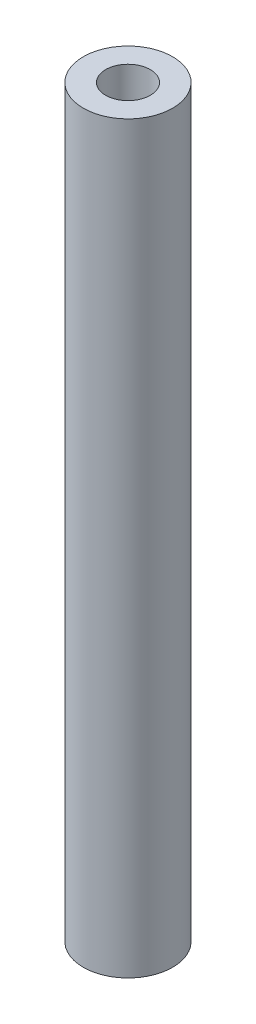
ISO-10303-21;
HEADER;
FILE_DESCRIPTION(('STEP AP214'),'2;1');
FILE_NAME('part.step','',(''),(''),'','','');
FILE_SCHEMA(('AUTOMOTIVE_DESIGN { 1 0 10303 214 1 1 1 1 }'));
ENDSEC;
DATA;
#1=APPLICATION_CONTEXT('core data for automotive mechanical design processes');
#2=APPLICATION_PROTOCOL_DEFINITION('international standard','automotive_design',2000,#1);
#3=PRODUCT_CONTEXT('',#1,'mechanical');
#4=PRODUCT('Part','Part','',(#3));
#5=PRODUCT_RELATED_PRODUCT_CATEGORY('part','',(#4));
#6=PRODUCT_DEFINITION_FORMATION('','',#4);
#7=PRODUCT_DEFINITION_CONTEXT('part definition',#1,'design');
#8=PRODUCT_DEFINITION('design','',#6,#7);
#9=PRODUCT_DEFINITION_SHAPE('','',#8);
#10=(LENGTH_UNIT() NAMED_UNIT(*) SI_UNIT(.MILLI.,.METRE.));
#11=(NAMED_UNIT(*) PLANE_ANGLE_UNIT() SI_UNIT($,.RADIAN.));
#12=(NAMED_UNIT(*) SI_UNIT($,.STERADIAN.) SOLID_ANGLE_UNIT());
#13=UNCERTAINTY_MEASURE_WITH_UNIT(LENGTH_MEASURE(1.E-05),#10,'distance_accuracy_value','');
#14=(GEOMETRIC_REPRESENTATION_CONTEXT(3) GLOBAL_UNCERTAINTY_ASSIGNED_CONTEXT((#13)) GLOBAL_UNIT_ASSIGNED_CONTEXT((#10,
#11,#12)) REPRESENTATION_CONTEXT('',''));
#15=CARTESIAN_POINT('',(0.,0.,0.));
#16=DIRECTION('',(0.,0.,1.));
#17=DIRECTION('',(1.,0.,0.));
#18=AXIS2_PLACEMENT_3D('',#15,#16,#17);
#19=CARTESIAN_POINT('',(0.,50.,0.));
#20=DIRECTION('',(0.,1.,0.));
#21=DIRECTION('',(0.,0.,1.));
#22=AXIS2_PLACEMENT_3D('',#19,#20,#21);
#23=PLANE('',#22);
#24=CARTESIAN_POINT('',(0.,50.,0.));
#25=DIRECTION('',(0.,1.,0.));
#26=DIRECTION('',(0.,0.,1.));
#27=AXIS2_PLACEMENT_3D('',#24,#25,#26);
#28=CIRCLE('',#27,3.);
#29=CARTESIAN_POINT('',(0.,50.,3.));
#30=VERTEX_POINT('',#29);
#31=EDGE_CURVE('E10',#30,#30,#28,.T.);
#32=ORIENTED_EDGE('',*,*,#31,.T.);
#33=EDGE_LOOP('',(#32));
#34=FACE_BOUND('',#33,.T.);
#35=CARTESIAN_POINT('',(0.,50.,0.));
#36=DIRECTION('',(0.,1.,0.));
#37=DIRECTION('',(0.,0.,1.));
#38=AXIS2_PLACEMENT_3D('',#35,#36,#37);
#39=CIRCLE('',#38,1.5);
#40=CARTESIAN_POINT('',(0.,50.,1.5));
#41=VERTEX_POINT('',#40);
#42=EDGE_CURVE('E50',#41,#41,#39,.T.);
#43=ORIENTED_EDGE('',*,*,#42,.F.);
#44=EDGE_LOOP('',(#43));
#45=FACE_BOUND('',#44,.T.);
#46=ADVANCED_FACE('F37',(#34,#45),#23,.T.);
#47=CARTESIAN_POINT('',(0.,0.,0.));
#48=DIRECTION('',(0.,1.,0.));
#49=DIRECTION('',(0.,0.,1.));
#50=AXIS2_PLACEMENT_3D('',#47,#48,#49);
#51=PLANE('',#50);
#52=CARTESIAN_POINT('',(0.,0.,0.));
#53=DIRECTION('',(0.,1.,0.));
#54=DIRECTION('',(0.,0.,1.));
#55=AXIS2_PLACEMENT_3D('',#52,#53,#54);
#56=CIRCLE('',#55,3.);
#57=CARTESIAN_POINT('',(0.,0.,3.));
#58=VERTEX_POINT('',#57);
#59=EDGE_CURVE('E41',#58,#58,#56,.T.);
#60=ORIENTED_EDGE('',*,*,#59,.F.);
#61=EDGE_LOOP('',(#60));
#62=FACE_BOUND('',#61,.T.);
#63=CARTESIAN_POINT('',(0.,0.,0.));
#64=DIRECTION('',(0.,1.,0.));
#65=DIRECTION('',(0.,0.,1.));
#66=AXIS2_PLACEMENT_3D('',#63,#64,#65);
#67=CIRCLE('',#66,1.5);
#68=CARTESIAN_POINT('',(0.,0.,1.5));
#69=VERTEX_POINT('',#68);
#70=EDGE_CURVE('E52',#69,#69,#67,.T.);
#71=ORIENTED_EDGE('',*,*,#70,.T.);
#72=EDGE_LOOP('',(#71));
#73=FACE_BOUND('',#72,.T.);
#74=ADVANCED_FACE('F64',(#62,#73),#51,.F.);
#75=CARTESIAN_POINT('',(0.,50.,0.));
#76=DIRECTION('',(0.,-1.,0.));
#77=DIRECTION('',(0.,0.,-1.));
#78=AXIS2_PLACEMENT_3D('',#75,#76,#77);
#79=CYLINDRICAL_SURFACE('',#78,3.);
#80=ORIENTED_EDGE('',*,*,#31,.F.);
#81=EDGE_LOOP('',(#80));
#82=FACE_BOUND('',#81,.T.);
#83=ORIENTED_EDGE('',*,*,#59,.T.);
#84=EDGE_LOOP('',(#83));
#85=FACE_BOUND('',#84,.T.);
#86=ADVANCED_FACE('F39',(#82,#85),#79,.T.);
#87=CARTESIAN_POINT('',(0.,50.,0.));
#88=DIRECTION('',(0.,-1.,0.));
#89=DIRECTION('',(0.,0.,-1.));
#90=AXIS2_PLACEMENT_3D('',#87,#88,#89);
#91=CYLINDRICAL_SURFACE('',#90,1.5);
#92=ORIENTED_EDGE('',*,*,#42,.T.);
#93=EDGE_LOOP('',(#92));
#94=FACE_BOUND('',#93,.T.);
#95=ORIENTED_EDGE('',*,*,#70,.F.);
#96=EDGE_LOOP('',(#95));
#97=FACE_BOUND('',#96,.T.);
#98=ADVANCED_FACE('F60',(#94,#97),#91,.F.);
#99=CLOSED_SHELL('',(#46,#74,#86,#98));
#100=MANIFOLD_SOLID_BREP('B2',#99);
#101=ADVANCED_BREP_SHAPE_REPRESENTATION('',(#18,#100),#14);
#102=SHAPE_DEFINITION_REPRESENTATION(#9,#101);
ENDSEC;
END-ISO-10303-21;
